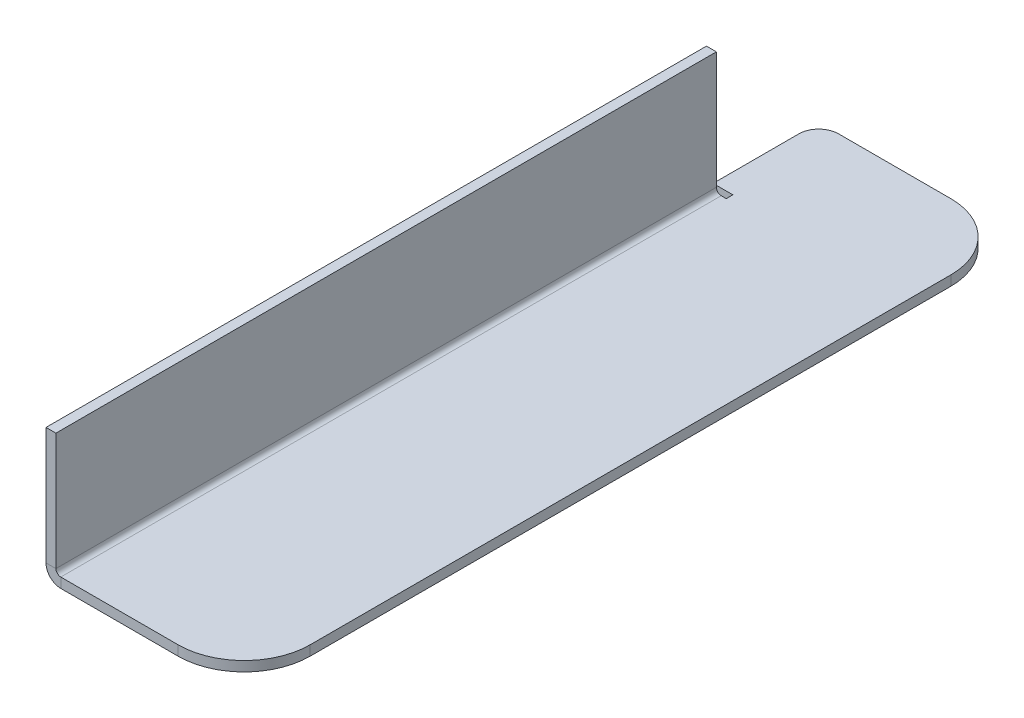
ISO-10303-21;
HEADER;
FILE_DESCRIPTION(('STEP AP214'),'2;1');
FILE_NAME('part.step','',(''),(''),'','','');
FILE_SCHEMA(('AUTOMOTIVE_DESIGN { 1 0 10303 214 1 1 1 1 }'));
ENDSEC;
DATA;
#1=APPLICATION_CONTEXT('core data for automotive mechanical design processes');
#2=APPLICATION_PROTOCOL_DEFINITION('international standard','automotive_design',2000,#1);
#3=PRODUCT_CONTEXT('',#1,'mechanical');
#4=PRODUCT('Part','Part','',(#3));
#5=PRODUCT_RELATED_PRODUCT_CATEGORY('part','',(#4));
#6=PRODUCT_DEFINITION_FORMATION('','',#4);
#7=PRODUCT_DEFINITION_CONTEXT('part definition',#1,'design');
#8=PRODUCT_DEFINITION('design','',#6,#7);
#9=PRODUCT_DEFINITION_SHAPE('','',#8);
#10=(LENGTH_UNIT() NAMED_UNIT(*) SI_UNIT(.MILLI.,.METRE.));
#11=(NAMED_UNIT(*) PLANE_ANGLE_UNIT() SI_UNIT($,.RADIAN.));
#12=(NAMED_UNIT(*) SI_UNIT($,.STERADIAN.) SOLID_ANGLE_UNIT());
#13=UNCERTAINTY_MEASURE_WITH_UNIT(LENGTH_MEASURE(1.E-05),#10,'distance_accuracy_value','');
#14=(GEOMETRIC_REPRESENTATION_CONTEXT(3) GLOBAL_UNCERTAINTY_ASSIGNED_CONTEXT((#13)) GLOBAL_UNIT_ASSIGNED_CONTEXT((#10,
#11,#12)) REPRESENTATION_CONTEXT('',''));
#15=CARTESIAN_POINT('',(0.,0.,0.));
#16=DIRECTION('',(0.,0.,1.));
#17=DIRECTION('',(1.,0.,0.));
#18=AXIS2_PLACEMENT_3D('',#15,#16,#17);
#19=CARTESIAN_POINT('',(-12.,-1.5,-55.5));
#20=DIRECTION('',(0.,1.,0.));
#21=DIRECTION('',(0.,0.,1.));
#22=AXIS2_PLACEMENT_3D('',#19,#20,#21);
#23=CYLINDRICAL_SURFACE('',#22,3.);
#24=CARTESIAN_POINT('',(-12.,-1.5,-55.5));
#25=DIRECTION('',(0.,-1.,0.));
#26=DIRECTION('',(0.,0.,-1.));
#27=AXIS2_PLACEMENT_3D('',#24,#25,#26);
#28=CIRCLE('',#27,3.);
#29=CARTESIAN_POINT('',(-15.,-1.5,-55.5));
#30=VERTEX_POINT('',#29);
#31=CARTESIAN_POINT('',(-12.,-1.5,-58.5));
#32=VERTEX_POINT('',#31);
#33=EDGE_CURVE('E193',#30,#32,#28,.T.);
#34=ORIENTED_EDGE('',*,*,#33,.F.);
#35=DIRECTION('',(0.,-1.,0.));
#36=VECTOR('',#35,1.);
#37=CARTESIAN_POINT('',(-15.,-1.5,-55.5));
#38=LINE('',#37,#36);
#39=CARTESIAN_POINT('',(-15.,0.,-55.5));
#40=VERTEX_POINT('',#39);
#41=EDGE_CURVE('E281',#40,#30,#38,.T.);
#42=ORIENTED_EDGE('',*,*,#41,.F.);
#43=CARTESIAN_POINT('',(-12.,0.,-55.5));
#44=DIRECTION('',(0.,1.,0.));
#45=DIRECTION('',(0.,0.,-1.));
#46=AXIS2_PLACEMENT_3D('',#43,#44,#45);
#47=CIRCLE('',#46,3.);
#48=CARTESIAN_POINT('',(-12.,0.,-58.5));
#49=VERTEX_POINT('',#48);
#50=EDGE_CURVE('E219',#49,#40,#47,.T.);
#51=ORIENTED_EDGE('',*,*,#50,.F.);
#52=DIRECTION('',(0.,1.,0.));
#53=VECTOR('',#52,1.);
#54=CARTESIAN_POINT('',(-12.,-1.5,-58.5));
#55=LINE('',#54,#53);
#56=EDGE_CURVE('E284',#32,#49,#55,.T.);
#57=ORIENTED_EDGE('',*,*,#56,.F.);
#58=EDGE_LOOP('',(#34,#42,#51,#57));
#59=FACE_BOUND('',#58,.T.);
#60=ADVANCED_FACE('F17',(#59),#23,.T.);
#61=CARTESIAN_POINT('',(5.,-1.5,48.5));
#62=DIRECTION('',(0.,1.,0.));
#63=DIRECTION('',(0.,0.,1.));
#64=AXIS2_PLACEMENT_3D('',#61,#62,#63);
#65=CYLINDRICAL_SURFACE('',#64,10.);
#66=CARTESIAN_POINT('',(5.,-1.5,48.5));
#67=DIRECTION('',(0.,-1.,0.));
#68=DIRECTION('',(0.,0.,-1.));
#69=AXIS2_PLACEMENT_3D('',#66,#67,#68);
#70=CIRCLE('',#69,10.);
#71=CARTESIAN_POINT('',(15.,-1.5,48.5));
#72=VERTEX_POINT('',#71);
#73=CARTESIAN_POINT('',(5.,-1.5,58.5));
#74=VERTEX_POINT('',#73);
#75=EDGE_CURVE('E180',#72,#74,#70,.T.);
#76=ORIENTED_EDGE('',*,*,#75,.F.);
#77=DIRECTION('',(0.,-1.,0.));
#78=VECTOR('',#77,1.);
#79=CARTESIAN_POINT('',(15.,-1.5,48.5));
#80=LINE('',#79,#78);
#81=CARTESIAN_POINT('',(15.,0.,48.5));
#82=VERTEX_POINT('',#81);
#83=EDGE_CURVE('E172',#82,#72,#80,.T.);
#84=ORIENTED_EDGE('',*,*,#83,.F.);
#85=CARTESIAN_POINT('',(5.,0.,48.5));
#86=DIRECTION('',(0.,1.,0.));
#87=DIRECTION('',(0.,0.,-1.));
#88=AXIS2_PLACEMENT_3D('',#85,#86,#87);
#89=CIRCLE('',#88,10.);
#90=CARTESIAN_POINT('',(5.,0.,58.5));
#91=VERTEX_POINT('',#90);
#92=EDGE_CURVE('E209',#91,#82,#89,.T.);
#93=ORIENTED_EDGE('',*,*,#92,.F.);
#94=DIRECTION('',(0.,1.,0.));
#95=VECTOR('',#94,1.);
#96=CARTESIAN_POINT('',(5.,-1.5,58.5));
#97=LINE('',#96,#95);
#98=EDGE_CURVE('E369',#74,#91,#97,.T.);
#99=ORIENTED_EDGE('',*,*,#98,.F.);
#100=EDGE_LOOP('',(#76,#84,#93,#99));
#101=FACE_BOUND('',#100,.T.);
#102=ADVANCED_FACE('F387',(#101),#65,.T.);
#103=CARTESIAN_POINT('',(5.,-1.5,-48.5));
#104=DIRECTION('',(0.,1.,0.));
#105=DIRECTION('',(0.,0.,1.));
#106=AXIS2_PLACEMENT_3D('',#103,#104,#105);
#107=CYLINDRICAL_SURFACE('',#106,10.);
#108=CARTESIAN_POINT('',(5.,-1.5,-48.5));
#109=DIRECTION('',(0.,-1.,0.));
#110=DIRECTION('',(0.,0.,-1.));
#111=AXIS2_PLACEMENT_3D('',#108,#109,#110);
#112=CIRCLE('',#111,10.);
#113=CARTESIAN_POINT('',(5.,-1.5,-58.5));
#114=VERTEX_POINT('',#113);
#115=CARTESIAN_POINT('',(15.,-1.5,-48.5));
#116=VERTEX_POINT('',#115);
#117=EDGE_CURVE('E164',#114,#116,#112,.T.);
#118=ORIENTED_EDGE('',*,*,#117,.F.);
#119=DIRECTION('',(0.,-1.,0.));
#120=VECTOR('',#119,1.);
#121=CARTESIAN_POINT('',(5.,-1.5,-58.5));
#122=LINE('',#121,#120);
#123=CARTESIAN_POINT('',(5.,0.,-58.5));
#124=VERTEX_POINT('',#123);
#125=EDGE_CURVE('E292',#124,#114,#122,.T.);
#126=ORIENTED_EDGE('',*,*,#125,.F.);
#127=CARTESIAN_POINT('',(5.,0.,-48.5));
#128=DIRECTION('',(0.,1.,0.));
#129=DIRECTION('',(0.,0.,-1.));
#130=AXIS2_PLACEMENT_3D('',#127,#128,#129);
#131=CIRCLE('',#130,10.);
#132=CARTESIAN_POINT('',(15.,0.,-48.5));
#133=VERTEX_POINT('',#132);
#134=EDGE_CURVE('E167',#133,#124,#131,.T.);
#135=ORIENTED_EDGE('',*,*,#134,.F.);
#136=DIRECTION('',(0.,1.,0.));
#137=VECTOR('',#136,1.);
#138=CARTESIAN_POINT('',(15.,-1.5,-48.5));
#139=LINE('',#138,#137);
#140=EDGE_CURVE('E160',#116,#133,#139,.T.);
#141=ORIENTED_EDGE('',*,*,#140,.F.);
#142=EDGE_LOOP('',(#118,#126,#135,#141));
#143=FACE_BOUND('',#142,.T.);
#144=ADVANCED_FACE('F162',(#143),#107,.T.);
#145=CARTESIAN_POINT('',(-15.,18.5,-41.5));
#146=DIRECTION('',(0.,-1.,0.));
#147=DIRECTION('',(0.,0.,-1.));
#148=AXIS2_PLACEMENT_3D('',#145,#146,#147);
#149=PLANE('',#148);
#150=DIRECTION('',(0.,0.,-1.));
#151=VECTOR('',#150,1.);
#152=CARTESIAN_POINT('',(-13.5,18.5,-41.5));
#153=LINE('',#152,#151);
#154=CARTESIAN_POINT('',(-13.5,18.5,58.5));
#155=VERTEX_POINT('',#154);
#156=CARTESIAN_POINT('',(-13.5,18.5,-41.5));
#157=VERTEX_POINT('',#156);
#158=EDGE_CURVE('E11',#155,#157,#153,.T.);
#159=ORIENTED_EDGE('',*,*,#158,.T.);
#160=DIRECTION('',(1.,0.,0.));
#161=VECTOR('',#160,1.);
#162=CARTESIAN_POINT('',(-15.,18.5,-41.5));
#163=LINE('',#162,#161);
#164=CARTESIAN_POINT('',(-15.,18.5,-41.5));
#165=VERTEX_POINT('',#164);
#166=EDGE_CURVE('E245',#165,#157,#163,.T.);
#167=ORIENTED_EDGE('',*,*,#166,.F.);
#168=DIRECTION('',(0.,0.,-1.));
#169=VECTOR('',#168,1.);
#170=CARTESIAN_POINT('',(-15.,18.5,0.));
#171=LINE('',#170,#169);
#172=CARTESIAN_POINT('',(-15.,18.5,58.5));
#173=VERTEX_POINT('',#172);
#174=EDGE_CURVE('E25',#173,#165,#171,.T.);
#175=ORIENTED_EDGE('',*,*,#174,.F.);
#176=DIRECTION('',(1.,0.,0.));
#177=VECTOR('',#176,1.);
#178=CARTESIAN_POINT('',(-15.,18.5,58.5));
#179=LINE('',#178,#177);
#180=EDGE_CURVE('E289',#173,#155,#179,.T.);
#181=ORIENTED_EDGE('',*,*,#180,.T.);
#182=EDGE_LOOP('',(#159,#167,#175,#181));
#183=FACE_BOUND('',#182,.T.);
#184=ADVANCED_FACE('F334',(#183),#149,.F.);
#185=CARTESIAN_POINT('',(-13.5,0.,0.));
#186=DIRECTION('',(1.,0.,0.));
#187=DIRECTION('',(0.,1.,0.));
#188=AXIS2_PLACEMENT_3D('',#185,#186,#187);
#189=PLANE('',#188);
#190=DIRECTION('',(0.,1.,0.));
#191=VECTOR('',#190,1.);
#192=CARTESIAN_POINT('',(-13.5,18.5,58.5));
#193=LINE('',#192,#191);
#194=CARTESIAN_POINT('',(-13.5,0.736599999999991,58.5));
#195=VERTEX_POINT('',#194);
#196=EDGE_CURVE('E236',#195,#155,#193,.T.);
#197=ORIENTED_EDGE('',*,*,#196,.F.);
#198=DIRECTION('',(0.,0.,1.));
#199=VECTOR('',#198,1.);
#200=CARTESIAN_POINT('',(-13.5,0.7366,-41.5));
#201=LINE('',#200,#199);
#202=CARTESIAN_POINT('',(-13.5,0.7366,-41.5));
#203=VERTEX_POINT('',#202);
#204=EDGE_CURVE('E232',#203,#195,#201,.T.);
#205=ORIENTED_EDGE('',*,*,#204,.F.);
#206=DIRECTION('',(0.,-1.,0.));
#207=VECTOR('',#206,1.);
#208=CARTESIAN_POINT('',(-13.5,0.,-41.5));
#209=LINE('',#208,#207);
#210=EDGE_CURVE('E242',#157,#203,#209,.T.);
#211=ORIENTED_EDGE('',*,*,#210,.F.);
#212=ORIENTED_EDGE('',*,*,#158,.F.);
#213=EDGE_LOOP('',(#197,#205,#211,#212));
#214=FACE_BOUND('',#213,.T.);
#215=ADVANCED_FACE('F344',(#214),#189,.T.);
#216=CARTESIAN_POINT('',(-15.,0.,0.));
#217=DIRECTION('',(1.,0.,0.));
#218=DIRECTION('',(0.,1.,0.));
#219=AXIS2_PLACEMENT_3D('',#216,#217,#218);
#220=PLANE('',#219);
#221=DIRECTION('',(0.,0.,-1.));
#222=VECTOR('',#221,1.);
#223=CARTESIAN_POINT('',(-15.,0.736599999999992,-41.5));
#224=LINE('',#223,#222);
#225=CARTESIAN_POINT('',(-15.,0.736599999999987,58.5));
#226=VERTEX_POINT('',#225);
#227=CARTESIAN_POINT('',(-15.,0.7366,-41.5));
#228=VERTEX_POINT('',#227);
#229=EDGE_CURVE('E237',#226,#228,#224,.T.);
#230=ORIENTED_EDGE('',*,*,#229,.F.);
#231=DIRECTION('',(0.,1.,0.));
#232=VECTOR('',#231,1.);
#233=CARTESIAN_POINT('',(-15.,0.,58.5));
#234=LINE('',#233,#232);
#235=EDGE_CURVE('E285',#226,#173,#234,.T.);
#236=ORIENTED_EDGE('',*,*,#235,.T.);
#237=ORIENTED_EDGE('',*,*,#174,.T.);
#238=DIRECTION('',(0.,-1.,0.));
#239=VECTOR('',#238,1.);
#240=CARTESIAN_POINT('',(-15.,0.,-41.5));
#241=LINE('',#240,#239);
#242=EDGE_CURVE('E288',#165,#228,#241,.T.);
#243=ORIENTED_EDGE('',*,*,#242,.T.);
#244=EDGE_LOOP('',(#230,#236,#237,#243));
#245=FACE_BOUND('',#244,.T.);
#246=ADVANCED_FACE('F337',(#245),#220,.F.);
#247=CARTESIAN_POINT('',(-15.,0.,-41.5));
#248=DIRECTION('',(0.,0.,1.));
#249=DIRECTION('',(1.,0.,0.));
#250=AXIS2_PLACEMENT_3D('',#247,#248,#249);
#251=PLANE('',#250);
#252=DIRECTION('',(-1.,0.,0.));
#253=VECTOR('',#252,1.);
#254=CARTESIAN_POINT('',(-15.,0.736599999999992,-41.5));
#255=LINE('',#254,#253);
#256=EDGE_CURVE('E295',#203,#228,#255,.T.);
#257=ORIENTED_EDGE('',*,*,#256,.T.);
#258=ORIENTED_EDGE('',*,*,#242,.F.);
#259=ORIENTED_EDGE('',*,*,#166,.T.);
#260=ORIENTED_EDGE('',*,*,#210,.T.);
#261=EDGE_LOOP('',(#257,#258,#259,#260));
#262=FACE_BOUND('',#261,.T.);
#263=ADVANCED_FACE('F332',(#262),#251,.F.);
#264=CARTESIAN_POINT('',(-15.,18.5,58.5));
#265=DIRECTION('',(0.,0.,-1.));
#266=DIRECTION('',(-1.,0.,0.));
#267=AXIS2_PLACEMENT_3D('',#264,#265,#266);
#268=PLANE('',#267);
#269=DIRECTION('',(-1.,0.,0.));
#270=VECTOR('',#269,1.);
#271=CARTESIAN_POINT('',(-13.5,0.736599999999992,58.5));
#272=LINE('',#271,#270);
#273=EDGE_CURVE('E310',#195,#226,#272,.T.);
#274=ORIENTED_EDGE('',*,*,#273,.F.);
#275=ORIENTED_EDGE('',*,*,#196,.T.);
#276=ORIENTED_EDGE('',*,*,#180,.F.);
#277=ORIENTED_EDGE('',*,*,#235,.F.);
#278=EDGE_LOOP('',(#274,#275,#276,#277));
#279=FACE_BOUND('',#278,.T.);
#280=ADVANCED_FACE('F341',(#279),#268,.F.);
#281=CARTESIAN_POINT('',(-12.7634,0.7366,58.5));
#282=DIRECTION('',(0.,0.,1.));
#283=DIRECTION('',(-1.,0.,0.));
#284=AXIS2_PLACEMENT_3D('',#281,#282,#283);
#285=CYLINDRICAL_SURFACE('',#284,0.7366);
#286=DIRECTION('',(0.,0.,-1.));
#287=VECTOR('',#286,1.);
#288=CARTESIAN_POINT('',(-12.7634,0.,58.5));
#289=LINE('',#288,#287);
#290=CARTESIAN_POINT('',(-12.7634,0.,58.5));
#291=VERTEX_POINT('',#290);
#292=CARTESIAN_POINT('',(-12.7634,0.,-41.5));
#293=VERTEX_POINT('',#292);
#294=EDGE_CURVE('E206',#291,#293,#289,.T.);
#295=ORIENTED_EDGE('',*,*,#294,.T.);
#296=CARTESIAN_POINT('',(-12.7634,0.7366,-41.5));
#297=DIRECTION('',(0.,0.,-1.));
#298=DIRECTION('',(0.,-1.,0.));
#299=AXIS2_PLACEMENT_3D('',#296,#297,#298);
#300=CIRCLE('',#299,0.7366);
#301=EDGE_CURVE('E299',#293,#203,#300,.T.);
#302=ORIENTED_EDGE('',*,*,#301,.T.);
#303=ORIENTED_EDGE('',*,*,#204,.T.);
#304=CARTESIAN_POINT('',(-12.7634,0.7366,58.5));
#305=DIRECTION('',(0.,0.,1.));
#306=DIRECTION('',(0.,-1.,0.));
#307=AXIS2_PLACEMENT_3D('',#304,#305,#306);
#308=CIRCLE('',#307,0.7366);
#309=EDGE_CURVE('E307',#195,#291,#308,.T.);
#310=ORIENTED_EDGE('',*,*,#309,.T.);
#311=EDGE_LOOP('',(#295,#302,#303,#310));
#312=FACE_BOUND('',#311,.T.);
#313=ADVANCED_FACE('F346',(#312),#285,.F.);
#314=CARTESIAN_POINT('',(-12.7634,0.7366,58.5));
#315=DIRECTION('',(0.,0.,1.));
#316=DIRECTION('',(-1.,0.,0.));
#317=AXIS2_PLACEMENT_3D('',#314,#315,#316);
#318=CYLINDRICAL_SURFACE('',#317,2.2366);
#319=DIRECTION('',(0.,0.,-1.));
#320=VECTOR('',#319,1.);
#321=CARTESIAN_POINT('',(-12.7634,-1.5,58.5));
#322=LINE('',#321,#320);
#323=CARTESIAN_POINT('',(-12.7634,-1.5,58.5));
#324=VERTEX_POINT('',#323);
#325=CARTESIAN_POINT('',(-12.7634,-1.5,-41.5));
#326=VERTEX_POINT('',#325);
#327=EDGE_CURVE('E212',#324,#326,#322,.T.);
#328=ORIENTED_EDGE('',*,*,#327,.F.);
#329=CARTESIAN_POINT('',(-12.7634,0.7366,58.5));
#330=DIRECTION('',(0.,0.,1.));
#331=DIRECTION('',(0.,-1.,0.));
#332=AXIS2_PLACEMENT_3D('',#329,#330,#331);
#333=CIRCLE('',#332,2.2366);
#334=EDGE_CURVE('E314',#226,#324,#333,.T.);
#335=ORIENTED_EDGE('',*,*,#334,.F.);
#336=ORIENTED_EDGE('',*,*,#229,.T.);
#337=CARTESIAN_POINT('',(-12.7634,0.7366,-41.5));
#338=DIRECTION('',(0.,0.,-1.));
#339=DIRECTION('',(0.,-1.,0.));
#340=AXIS2_PLACEMENT_3D('',#337,#338,#339);
#341=CIRCLE('',#340,2.2366);
#342=EDGE_CURVE('E303',#326,#228,#341,.T.);
#343=ORIENTED_EDGE('',*,*,#342,.F.);
#344=EDGE_LOOP('',(#328,#335,#336,#343));
#345=FACE_BOUND('',#344,.T.);
#346=ADVANCED_FACE('F354',(#345),#318,.T.);
#347=CARTESIAN_POINT('',(-12.7634,0.7366,58.5));
#348=DIRECTION('',(0.,0.,-1.));
#349=DIRECTION('',(-1.,0.,0.));
#350=AXIS2_PLACEMENT_3D('',#347,#348,#349);
#351=PLANE('',#350);
#352=ORIENTED_EDGE('',*,*,#309,.F.);
#353=ORIENTED_EDGE('',*,*,#273,.T.);
#354=ORIENTED_EDGE('',*,*,#334,.T.);
#355=DIRECTION('',(0.,-1.,0.));
#356=VECTOR('',#355,1.);
#357=CARTESIAN_POINT('',(-12.7634,0.,58.5));
#358=LINE('',#357,#356);
#359=EDGE_CURVE('E205',#291,#324,#358,.T.);
#360=ORIENTED_EDGE('',*,*,#359,.F.);
#361=EDGE_LOOP('',(#352,#353,#354,#360));
#362=FACE_BOUND('',#361,.T.);
#363=ADVANCED_FACE('F358',(#362),#351,.F.);
#364=CARTESIAN_POINT('',(-12.7634,0.7366,-41.5));
#365=DIRECTION('',(0.,0.,-1.));
#366=DIRECTION('',(-1.,0.,0.));
#367=AXIS2_PLACEMENT_3D('',#364,#365,#366);
#368=PLANE('',#367);
#369=ORIENTED_EDGE('',*,*,#256,.F.);
#370=ORIENTED_EDGE('',*,*,#301,.F.);
#371=DIRECTION('',(0.,-1.,0.));
#372=VECTOR('',#371,1.);
#373=CARTESIAN_POINT('',(-12.7634,0.,-41.5));
#374=LINE('',#373,#372);
#375=EDGE_CURVE('E265',#293,#326,#374,.T.);
#376=ORIENTED_EDGE('',*,*,#375,.T.);
#377=ORIENTED_EDGE('',*,*,#342,.T.);
#378=EDGE_LOOP('',(#369,#370,#376,#377));
#379=FACE_BOUND('',#378,.T.);
#380=ADVANCED_FACE('F351',(#379),#368,.T.);
#381=CARTESIAN_POINT('',(-15.,-1.5,-58.5));
#382=DIRECTION('',(0.,0.,-1.));
#383=DIRECTION('',(0.,-1.,0.));
#384=AXIS2_PLACEMENT_3D('',#381,#382,#383);
#385=PLANE('',#384);
#386=DIRECTION('',(-1.,0.,0.));
#387=VECTOR('',#386,1.);
#388=CARTESIAN_POINT('',(-15.,-1.5,-58.5));
#389=LINE('',#388,#387);
#390=EDGE_CURVE('E186',#114,#32,#389,.T.);
#391=ORIENTED_EDGE('',*,*,#390,.T.);
#392=ORIENTED_EDGE('',*,*,#56,.T.);
#393=DIRECTION('',(-1.,0.,0.));
#394=VECTOR('',#393,1.);
#395=CARTESIAN_POINT('',(-15.,0.,-58.5));
#396=LINE('',#395,#394);
#397=EDGE_CURVE('E224',#124,#49,#396,.T.);
#398=ORIENTED_EDGE('',*,*,#397,.F.);
#399=ORIENTED_EDGE('',*,*,#125,.T.);
#400=EDGE_LOOP('',(#391,#392,#398,#399));
#401=FACE_BOUND('',#400,.T.);
#402=ADVANCED_FACE('F391',(#401),#385,.T.);
#403=CARTESIAN_POINT('',(-15.,-1.5,-42.5));
#404=DIRECTION('',(-1.,0.,0.));
#405=DIRECTION('',(0.,0.,1.));
#406=AXIS2_PLACEMENT_3D('',#403,#404,#405);
#407=PLANE('',#406);
#408=DIRECTION('',(0.,0.,1.));
#409=VECTOR('',#408,1.);
#410=CARTESIAN_POINT('',(-15.,0.,-42.5));
#411=LINE('',#410,#409);
#412=CARTESIAN_POINT('',(-15.,0.,-42.5));
#413=VERTEX_POINT('',#412);
#414=EDGE_CURVE('E223',#40,#413,#411,.T.);
#415=ORIENTED_EDGE('',*,*,#414,.F.);
#416=ORIENTED_EDGE('',*,*,#41,.T.);
#417=DIRECTION('',(0.,0.,1.));
#418=VECTOR('',#417,1.);
#419=CARTESIAN_POINT('',(-15.,-1.5,-42.5));
#420=LINE('',#419,#418);
#421=CARTESIAN_POINT('',(-15.,-1.5,-42.5));
#422=VERTEX_POINT('',#421);
#423=EDGE_CURVE('E201',#30,#422,#420,.T.);
#424=ORIENTED_EDGE('',*,*,#423,.T.);
#425=DIRECTION('',(0.,1.,0.));
#426=VECTOR('',#425,1.);
#427=CARTESIAN_POINT('',(-15.,-1.5,-42.5));
#428=LINE('',#427,#426);
#429=EDGE_CURVE('E278',#422,#413,#428,.T.);
#430=ORIENTED_EDGE('',*,*,#429,.T.);
#431=EDGE_LOOP('',(#415,#416,#424,#430));
#432=FACE_BOUND('',#431,.T.);
#433=ADVANCED_FACE('F398',(#432),#407,.T.);
#434=CARTESIAN_POINT('',(-15.,-1.5,-42.5));
#435=DIRECTION('',(0.,0.,1.));
#436=DIRECTION('',(1.,0.,0.));
#437=AXIS2_PLACEMENT_3D('',#434,#435,#436);
#438=PLANE('',#437);
#439=DIRECTION('',(1.,0.,0.));
#440=VECTOR('',#439,1.);
#441=CARTESIAN_POINT('',(-15.,0.,-42.5));
#442=LINE('',#441,#440);
#443=CARTESIAN_POINT('',(-12.,0.,-42.5));
#444=VERTEX_POINT('',#443);
#445=EDGE_CURVE('E241',#413,#444,#442,.T.);
#446=ORIENTED_EDGE('',*,*,#445,.F.);
#447=ORIENTED_EDGE('',*,*,#429,.F.);
#448=DIRECTION('',(1.,0.,0.));
#449=VECTOR('',#448,1.);
#450=CARTESIAN_POINT('',(-15.,-1.5,-42.5));
#451=LINE('',#450,#449);
#452=CARTESIAN_POINT('',(-12.,-1.5,-42.5));
#453=VERTEX_POINT('',#452);
#454=EDGE_CURVE('E231',#422,#453,#451,.T.);
#455=ORIENTED_EDGE('',*,*,#454,.T.);
#456=DIRECTION('',(0.,1.,0.));
#457=VECTOR('',#456,1.);
#458=CARTESIAN_POINT('',(-12.,-1.5,-42.5));
#459=LINE('',#458,#457);
#460=EDGE_CURVE('E273',#453,#444,#459,.T.);
#461=ORIENTED_EDGE('',*,*,#460,.T.);
#462=EDGE_LOOP('',(#446,#447,#455,#461));
#463=FACE_BOUND('',#462,.T.);
#464=ADVANCED_FACE('F401',(#463),#438,.T.);
#465=CARTESIAN_POINT('',(-12.,-1.5,-42.5));
#466=DIRECTION('',(-1.,0.,0.));
#467=DIRECTION('',(0.,0.,1.));
#468=AXIS2_PLACEMENT_3D('',#465,#466,#467);
#469=PLANE('',#468);
#470=DIRECTION('',(0.,0.,1.));
#471=VECTOR('',#470,1.);
#472=CARTESIAN_POINT('',(-12.,0.,-42.5));
#473=LINE('',#472,#471);
#474=CARTESIAN_POINT('',(-12.,0.,-41.5));
#475=VERTEX_POINT('',#474);
#476=EDGE_CURVE('E249',#444,#475,#473,.T.);
#477=ORIENTED_EDGE('',*,*,#476,.F.);
#478=ORIENTED_EDGE('',*,*,#460,.F.);
#479=DIRECTION('',(0.,0.,1.));
#480=VECTOR('',#479,1.);
#481=CARTESIAN_POINT('',(-12.,-1.5,-42.5));
#482=LINE('',#481,#480);
#483=CARTESIAN_POINT('',(-12.,-1.5,-41.5));
#484=VERTEX_POINT('',#483);
#485=EDGE_CURVE('E197',#453,#484,#482,.T.);
#486=ORIENTED_EDGE('',*,*,#485,.T.);
#487=DIRECTION('',(0.,1.,0.));
#488=VECTOR('',#487,1.);
#489=CARTESIAN_POINT('',(-12.,-1.5,-41.5));
#490=LINE('',#489,#488);
#491=EDGE_CURVE('E270',#484,#475,#490,.T.);
#492=ORIENTED_EDGE('',*,*,#491,.T.);
#493=EDGE_LOOP('',(#477,#478,#486,#492));
#494=FACE_BOUND('',#493,.T.);
#495=ADVANCED_FACE('F406',(#494),#469,.T.);
#496=CARTESIAN_POINT('',(-15.,-1.5,-41.5));
#497=DIRECTION('',(0.,0.,-1.));
#498=DIRECTION('',(0.,-1.,0.));
#499=AXIS2_PLACEMENT_3D('',#496,#497,#498);
#500=PLANE('',#499);
#501=ORIENTED_EDGE('',*,*,#375,.F.);
#502=DIRECTION('',(-1.,0.,0.));
#503=VECTOR('',#502,1.);
#504=CARTESIAN_POINT('',(-15.,0.,-41.5));
#505=LINE('',#504,#503);
#506=EDGE_CURVE('E210',#475,#293,#505,.T.);
#507=ORIENTED_EDGE('',*,*,#506,.F.);
#508=ORIENTED_EDGE('',*,*,#491,.F.);
#509=DIRECTION('',(-1.,0.,0.));
#510=VECTOR('',#509,1.);
#511=CARTESIAN_POINT('',(-15.,-1.5,-41.5));
#512=LINE('',#511,#510);
#513=EDGE_CURVE('E215',#484,#326,#512,.T.);
#514=ORIENTED_EDGE('',*,*,#513,.T.);
#515=EDGE_LOOP('',(#501,#507,#508,#514));
#516=FACE_BOUND('',#515,.T.);
#517=ADVANCED_FACE('F409',(#516),#500,.T.);
#518=CARTESIAN_POINT('',(15.,-1.5,58.5));
#519=DIRECTION('',(1.,0.,0.));
#520=DIRECTION('',(0.,1.,0.));
#521=AXIS2_PLACEMENT_3D('',#518,#519,#520);
#522=PLANE('',#521);
#523=DIRECTION('',(0.,0.,-1.));
#524=VECTOR('',#523,1.);
#525=CARTESIAN_POINT('',(15.,-1.5,58.5));
#526=LINE('',#525,#524);
#527=EDGE_CURVE('E175',#72,#116,#526,.T.);
#528=ORIENTED_EDGE('',*,*,#527,.T.);
#529=ORIENTED_EDGE('',*,*,#140,.T.);
#530=DIRECTION('',(0.,0.,-1.));
#531=VECTOR('',#530,1.);
#532=CARTESIAN_POINT('',(15.,0.,58.5));
#533=LINE('',#532,#531);
#534=EDGE_CURVE('E259',#82,#133,#533,.T.);
#535=ORIENTED_EDGE('',*,*,#534,.F.);
#536=ORIENTED_EDGE('',*,*,#83,.T.);
#537=EDGE_LOOP('',(#528,#529,#535,#536));
#538=FACE_BOUND('',#537,.T.);
#539=ADVANCED_FACE('F176',(#538),#522,.T.);
#540=CARTESIAN_POINT('',(0.,0.,0.));
#541=DIRECTION('',(0.,-1.,0.));
#542=DIRECTION('',(0.,0.,-1.));
#543=AXIS2_PLACEMENT_3D('',#540,#541,#542);
#544=PLANE('',#543);
#545=ORIENTED_EDGE('',*,*,#397,.T.);
#546=ORIENTED_EDGE('',*,*,#50,.T.);
#547=ORIENTED_EDGE('',*,*,#414,.T.);
#548=ORIENTED_EDGE('',*,*,#445,.T.);
#549=ORIENTED_EDGE('',*,*,#476,.T.);
#550=ORIENTED_EDGE('',*,*,#506,.T.);
#551=ORIENTED_EDGE('',*,*,#294,.F.);
#552=DIRECTION('',(1.,0.,0.));
#553=VECTOR('',#552,1.);
#554=CARTESIAN_POINT('',(-15.,0.,58.5));
#555=LINE('',#554,#553);
#556=EDGE_CURVE('E364',#291,#91,#555,.T.);
#557=ORIENTED_EDGE('',*,*,#556,.T.);
#558=ORIENTED_EDGE('',*,*,#92,.T.);
#559=ORIENTED_EDGE('',*,*,#534,.T.);
#560=ORIENTED_EDGE('',*,*,#134,.T.);
#561=EDGE_LOOP('',(#545,#546,#547,#548,#549,#550,#551,#557,#558,#559,#560));
#562=FACE_BOUND('',#561,.T.);
#563=ADVANCED_FACE('F388',(#562),#544,.F.);
#564=CARTESIAN_POINT('',(0.,-1.5,0.));
#565=DIRECTION('',(0.,-1.,0.));
#566=DIRECTION('',(0.,0.,-1.));
#567=AXIS2_PLACEMENT_3D('',#564,#565,#566);
#568=PLANE('',#567);
#569=ORIENTED_EDGE('',*,*,#423,.F.);
#570=ORIENTED_EDGE('',*,*,#33,.T.);
#571=ORIENTED_EDGE('',*,*,#390,.F.);
#572=ORIENTED_EDGE('',*,*,#117,.T.);
#573=ORIENTED_EDGE('',*,*,#527,.F.);
#574=ORIENTED_EDGE('',*,*,#75,.T.);
#575=DIRECTION('',(1.,0.,0.));
#576=VECTOR('',#575,1.);
#577=CARTESIAN_POINT('',(-15.,-1.5,58.5));
#578=LINE('',#577,#576);
#579=EDGE_CURVE('E376',#324,#74,#578,.T.);
#580=ORIENTED_EDGE('',*,*,#579,.F.);
#581=ORIENTED_EDGE('',*,*,#327,.T.);
#582=ORIENTED_EDGE('',*,*,#513,.F.);
#583=ORIENTED_EDGE('',*,*,#485,.F.);
#584=ORIENTED_EDGE('',*,*,#454,.F.);
#585=EDGE_LOOP('',(#569,#570,#571,#572,#573,#574,#580,#581,#582,#583,#584));
#586=FACE_BOUND('',#585,.T.);
#587=ADVANCED_FACE('F183',(#586),#568,.T.);
#588=CARTESIAN_POINT('',(-15.,-1.5,58.5));
#589=DIRECTION('',(0.,0.,1.));
#590=DIRECTION('',(1.,0.,0.));
#591=AXIS2_PLACEMENT_3D('',#588,#589,#590);
#592=PLANE('',#591);
#593=ORIENTED_EDGE('',*,*,#579,.T.);
#594=ORIENTED_EDGE('',*,*,#98,.T.);
#595=ORIENTED_EDGE('',*,*,#556,.F.);
#596=ORIENTED_EDGE('',*,*,#359,.T.);
#597=EDGE_LOOP('',(#593,#594,#595,#596));
#598=FACE_BOUND('',#597,.T.);
#599=ADVANCED_FACE('F367',(#598),#592,.T.);
#600=CLOSED_SHELL('',(#60,#102,#144,#184,#215,#246,#263,#280,#313,#346,#363,#380,#402,#433,#464,
#495,#517,#539,#563,#587,#599));
#601=MANIFOLD_SOLID_BREP('B1',#600);
#602=ADVANCED_BREP_SHAPE_REPRESENTATION('',(#18,#601),#14);
#603=SHAPE_DEFINITION_REPRESENTATION(#9,#602);
ENDSEC;
END-ISO-10303-21;
